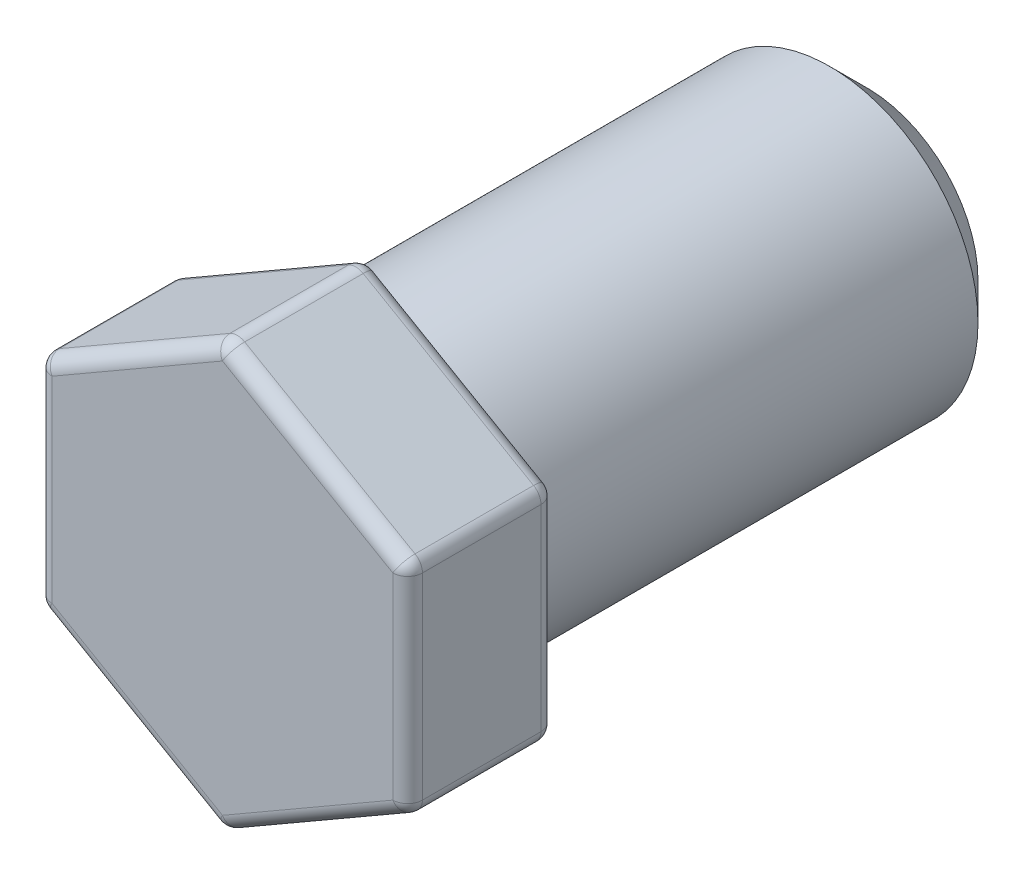
ISO-10303-21;
HEADER;
FILE_DESCRIPTION(('STEP AP214'),'2;1');
FILE_NAME('part.step','',(''),(''),'','','');
FILE_SCHEMA(('AUTOMOTIVE_DESIGN { 1 0 10303 214 1 1 1 1 }'));
ENDSEC;
DATA;
#1=APPLICATION_CONTEXT('core data for automotive mechanical design processes');
#2=APPLICATION_PROTOCOL_DEFINITION('international standard','automotive_design',2000,#1);
#3=PRODUCT_CONTEXT('',#1,'mechanical');
#4=PRODUCT('Part','Part','',(#3));
#5=PRODUCT_RELATED_PRODUCT_CATEGORY('part','',(#4));
#6=PRODUCT_DEFINITION_FORMATION('','',#4);
#7=PRODUCT_DEFINITION_CONTEXT('part definition',#1,'design');
#8=PRODUCT_DEFINITION('design','',#6,#7);
#9=PRODUCT_DEFINITION_SHAPE('','',#8);
#10=(LENGTH_UNIT() NAMED_UNIT(*) SI_UNIT(.MILLI.,.METRE.));
#11=(NAMED_UNIT(*) PLANE_ANGLE_UNIT() SI_UNIT($,.RADIAN.));
#12=(NAMED_UNIT(*) SI_UNIT($,.STERADIAN.) SOLID_ANGLE_UNIT());
#13=UNCERTAINTY_MEASURE_WITH_UNIT(LENGTH_MEASURE(1.E-05),#10,'distance_accuracy_value','');
#14=(GEOMETRIC_REPRESENTATION_CONTEXT(3) GLOBAL_UNCERTAINTY_ASSIGNED_CONTEXT((#13)) GLOBAL_UNIT_ASSIGNED_CONTEXT((#10,
#11,#12)) REPRESENTATION_CONTEXT('',''));
#15=CARTESIAN_POINT('',(0.,0.,0.));
#16=DIRECTION('',(0.,0.,1.));
#17=DIRECTION('',(1.,0.,0.));
#18=AXIS2_PLACEMENT_3D('',#15,#16,#17);
#19=CARTESIAN_POINT('',(0.,0.,6.7));
#20=DIRECTION('',(0.,0.,-1.));
#21=DIRECTION('',(-1.,0.,0.));
#22=AXIS2_PLACEMENT_3D('',#19,#20,#21);
#23=CYLINDRICAL_SURFACE('',#22,2.);
#24=CARTESIAN_POINT('',(0.,0.,0.500000000000001));
#25=DIRECTION('',(0.,0.,1.));
#26=DIRECTION('',(1.,0.,0.));
#27=AXIS2_PLACEMENT_3D('',#24,#25,#26);
#28=CIRCLE('',#27,2.);
#29=CARTESIAN_POINT('',(2.,0.,0.500000000000001));
#30=VERTEX_POINT('',#29);
#31=EDGE_CURVE('E43',#30,#30,#28,.T.);
#32=ORIENTED_EDGE('',*,*,#31,.T.);
#33=EDGE_LOOP('',(#32));
#34=FACE_BOUND('',#33,.T.);
#35=CARTESIAN_POINT('',(0.,0.,6.5));
#36=DIRECTION('',(0.,0.,1.));
#37=DIRECTION('',(1.,0.,0.));
#38=AXIS2_PLACEMENT_3D('',#35,#36,#37);
#39=CIRCLE('',#38,2.);
#40=CARTESIAN_POINT('',(2.,0.,6.5));
#41=VERTEX_POINT('',#40);
#42=EDGE_CURVE('E260',#41,#41,#39,.F.);
#43=ORIENTED_EDGE('',*,*,#42,.T.);
#44=EDGE_LOOP('',(#43));
#45=FACE_BOUND('',#44,.T.);
#46=ADVANCED_FACE('F35',(#34,#45),#23,.T.);
#47=CARTESIAN_POINT('',(0.,0.,0.));
#48=DIRECTION('',(0.,0.,1.));
#49=DIRECTION('',(1.,0.,0.));
#50=AXIS2_PLACEMENT_3D('',#47,#48,#49);
#51=PLANE('',#50);
#52=CARTESIAN_POINT('',(0.,0.,0.));
#53=DIRECTION('',(0.,0.,1.));
#54=DIRECTION('',(1.,0.,0.));
#55=AXIS2_PLACEMENT_3D('',#52,#53,#54);
#56=CIRCLE('',#55,1.5);
#57=CARTESIAN_POINT('',(1.5,0.,0.));
#58=VERTEX_POINT('',#57);
#59=EDGE_CURVE('E11',#58,#58,#56,.F.);
#60=ORIENTED_EDGE('',*,*,#59,.T.);
#61=EDGE_LOOP('',(#60));
#62=FACE_BOUND('',#61,.T.);
#63=ADVANCED_FACE('F374',(#62),#51,.F.);
#64=CARTESIAN_POINT('',(0.,-2.88675134594813,8.7));
#65=DIRECTION('',(-0.5,0.866025403784439,0.));
#66=DIRECTION('',(-0.866025403784439,-0.5,0.));
#67=AXIS2_PLACEMENT_3D('',#64,#65,#66);
#68=PLANE('',#67);
#69=DIRECTION('',(0.866025403784439,0.5,0.));
#70=VECTOR('',#69,1.);
#71=CARTESIAN_POINT('',(0.,-2.88675134594813,8.5));
#72=LINE('',#71,#70);
#73=CARTESIAN_POINT('',(2.4,-1.50111069989303,8.5));
#74=VERTEX_POINT('',#73);
#75=CARTESIAN_POINT('',(0.0999999999999994,-2.82901631902917,8.5));
#76=VERTEX_POINT('',#75);
#77=EDGE_CURVE('E237',#74,#76,#72,.F.);
#78=ORIENTED_EDGE('',*,*,#77,.T.);
#79=DIRECTION('',(0.,0.,-1.));
#80=VECTOR('',#79,1.);
#81=CARTESIAN_POINT('',(0.0999999999999995,-2.82901631902917,8.7));
#82=LINE('',#81,#80);
#83=CARTESIAN_POINT('',(0.0999999999999995,-2.82901631902917,6.9));
#84=VERTEX_POINT('',#83);
#85=EDGE_CURVE('E308',#76,#84,#82,.T.);
#86=ORIENTED_EDGE('',*,*,#85,.T.);
#87=DIRECTION('',(0.866025403784439,0.5,0.));
#88=VECTOR('',#87,1.);
#89=CARTESIAN_POINT('',(0.,-2.88675134594813,6.9));
#90=LINE('',#89,#88);
#91=CARTESIAN_POINT('',(2.4,-1.50111069989303,6.9));
#92=VERTEX_POINT('',#91);
#93=EDGE_CURVE('E234',#84,#92,#90,.T.);
#94=ORIENTED_EDGE('',*,*,#93,.T.);
#95=DIRECTION('',(0.,0.,-1.));
#96=VECTOR('',#95,1.);
#97=CARTESIAN_POINT('',(2.4,-1.50111069989303,8.7));
#98=LINE('',#97,#96);
#99=EDGE_CURVE('E306',#92,#74,#98,.F.);
#100=ORIENTED_EDGE('',*,*,#99,.T.);
#101=EDGE_LOOP('',(#78,#86,#94,#100));
#102=FACE_BOUND('',#101,.T.);
#103=ADVANCED_FACE('F380',(#102),#68,.F.);
#104=CARTESIAN_POINT('',(2.5,-1.44337567297407,8.7));
#105=DIRECTION('',(-1.,0.,0.));
#106=DIRECTION('',(0.,-1.,0.));
#107=AXIS2_PLACEMENT_3D('',#104,#105,#106);
#108=PLANE('',#107);
#109=DIRECTION('',(0.,1.,0.));
#110=VECTOR('',#109,1.);
#111=CARTESIAN_POINT('',(2.5,-1.44337567297407,6.9));
#112=LINE('',#111,#110);
#113=CARTESIAN_POINT('',(2.5,-1.32790561913614,6.9));
#114=VERTEX_POINT('',#113);
#115=CARTESIAN_POINT('',(2.5,1.32790561913614,6.9));
#116=VERTEX_POINT('',#115);
#117=EDGE_CURVE('E228',#114,#116,#112,.T.);
#118=ORIENTED_EDGE('',*,*,#117,.T.);
#119=DIRECTION('',(0.,0.,-1.));
#120=VECTOR('',#119,1.);
#121=CARTESIAN_POINT('',(2.5,1.32790561913614,8.7));
#122=LINE('',#121,#120);
#123=CARTESIAN_POINT('',(2.5,1.32790561913614,8.5));
#124=VERTEX_POINT('',#123);
#125=EDGE_CURVE('E327',#116,#124,#122,.F.);
#126=ORIENTED_EDGE('',*,*,#125,.T.);
#127=DIRECTION('',(0.,1.,0.));
#128=VECTOR('',#127,1.);
#129=CARTESIAN_POINT('',(2.5,-1.44337567297407,8.5));
#130=LINE('',#129,#128);
#131=CARTESIAN_POINT('',(2.5,-1.32790561913614,8.5));
#132=VERTEX_POINT('',#131);
#133=EDGE_CURVE('E231',#124,#132,#130,.F.);
#134=ORIENTED_EDGE('',*,*,#133,.T.);
#135=DIRECTION('',(0.,0.,-1.));
#136=VECTOR('',#135,1.);
#137=CARTESIAN_POINT('',(2.5,-1.32790561913614,8.7));
#138=LINE('',#137,#136);
#139=EDGE_CURVE('E325',#132,#114,#138,.T.);
#140=ORIENTED_EDGE('',*,*,#139,.T.);
#141=EDGE_LOOP('',(#118,#126,#134,#140));
#142=FACE_BOUND('',#141,.T.);
#143=ADVANCED_FACE('F559',(#142),#108,.F.);
#144=CARTESIAN_POINT('',(2.5,1.44337567297407,8.7));
#145=DIRECTION('',(-0.5,-0.866025403784439,0.));
#146=DIRECTION('',(0.866025403784439,-0.5,0.));
#147=AXIS2_PLACEMENT_3D('',#144,#145,#146);
#148=PLANE('',#147);
#149=DIRECTION('',(-0.866025403784439,0.5,0.));
#150=VECTOR('',#149,1.);
#151=CARTESIAN_POINT('',(2.5,1.44337567297407,8.5));
#152=LINE('',#151,#150);
#153=CARTESIAN_POINT('',(0.0999999999999994,2.82901631902917,8.5));
#154=VERTEX_POINT('',#153);
#155=CARTESIAN_POINT('',(2.4,1.50111069989303,8.5));
#156=VERTEX_POINT('',#155);
#157=EDGE_CURVE('E226',#154,#156,#152,.F.);
#158=ORIENTED_EDGE('',*,*,#157,.T.);
#159=DIRECTION('',(0.,0.,-1.));
#160=VECTOR('',#159,1.);
#161=CARTESIAN_POINT('',(2.4,1.50111069989303,8.7));
#162=LINE('',#161,#160);
#163=CARTESIAN_POINT('',(2.4,1.50111069989303,6.9));
#164=VERTEX_POINT('',#163);
#165=EDGE_CURVE('E57',#156,#164,#162,.T.);
#166=ORIENTED_EDGE('',*,*,#165,.T.);
#167=DIRECTION('',(-0.866025403784439,0.5,0.));
#168=VECTOR('',#167,1.);
#169=CARTESIAN_POINT('',(2.5,1.44337567297407,6.9));
#170=LINE('',#169,#168);
#171=CARTESIAN_POINT('',(0.0999999999999994,2.82901631902917,6.9));
#172=VERTEX_POINT('',#171);
#173=EDGE_CURVE('E224',#164,#172,#170,.T.);
#174=ORIENTED_EDGE('',*,*,#173,.T.);
#175=DIRECTION('',(0.,0.,-1.));
#176=VECTOR('',#175,1.);
#177=CARTESIAN_POINT('',(0.0999999999999994,2.82901631902917,8.7));
#178=LINE('',#177,#176);
#179=EDGE_CURVE('E322',#172,#154,#178,.F.);
#180=ORIENTED_EDGE('',*,*,#179,.T.);
#181=EDGE_LOOP('',(#158,#166,#174,#180));
#182=FACE_BOUND('',#181,.T.);
#183=ADVANCED_FACE('F504',(#182),#148,.F.);
#184=CARTESIAN_POINT('',(0.,2.88675134594813,8.7));
#185=DIRECTION('',(0.5,-0.866025403784439,0.));
#186=DIRECTION('',(0.866025403784439,0.5,0.));
#187=AXIS2_PLACEMENT_3D('',#184,#185,#186);
#188=PLANE('',#187);
#189=DIRECTION('',(-0.866025403784439,-0.5,0.));
#190=VECTOR('',#189,1.);
#191=CARTESIAN_POINT('',(0.,2.88675134594813,6.9));
#192=LINE('',#191,#190);
#193=CARTESIAN_POINT('',(-0.1,2.82901631902917,6.9));
#194=VERTEX_POINT('',#193);
#195=CARTESIAN_POINT('',(-2.4,1.50111069989303,6.9));
#196=VERTEX_POINT('',#195);
#197=EDGE_CURVE('E218',#194,#196,#192,.T.);
#198=ORIENTED_EDGE('',*,*,#197,.T.);
#199=DIRECTION('',(0.,0.,-1.));
#200=VECTOR('',#199,1.);
#201=CARTESIAN_POINT('',(-2.4,1.50111069989303,8.7));
#202=LINE('',#201,#200);
#203=CARTESIAN_POINT('',(-2.4,1.50111069989303,8.5));
#204=VERTEX_POINT('',#203);
#205=EDGE_CURVE('E320',#196,#204,#202,.F.);
#206=ORIENTED_EDGE('',*,*,#205,.T.);
#207=DIRECTION('',(-0.866025403784439,-0.5,0.));
#208=VECTOR('',#207,1.);
#209=CARTESIAN_POINT('',(0.,2.88675134594813,8.5));
#210=LINE('',#209,#208);
#211=CARTESIAN_POINT('',(-0.1,2.82901631902917,8.5));
#212=VERTEX_POINT('',#211);
#213=EDGE_CURVE('E221',#204,#212,#210,.F.);
#214=ORIENTED_EDGE('',*,*,#213,.T.);
#215=DIRECTION('',(0.,0.,-1.));
#216=VECTOR('',#215,1.);
#217=CARTESIAN_POINT('',(-0.1,2.82901631902917,8.7));
#218=LINE('',#217,#216);
#219=EDGE_CURVE('E318',#212,#194,#218,.T.);
#220=ORIENTED_EDGE('',*,*,#219,.T.);
#221=EDGE_LOOP('',(#198,#206,#214,#220));
#222=FACE_BOUND('',#221,.T.);
#223=ADVANCED_FACE('F513',(#222),#188,.F.);
#224=CARTESIAN_POINT('',(-2.5,1.44337567297407,8.7));
#225=DIRECTION('',(1.,0.,0.));
#226=DIRECTION('',(0.,1.,0.));
#227=AXIS2_PLACEMENT_3D('',#224,#225,#226);
#228=PLANE('',#227);
#229=DIRECTION('',(0.,-1.,0.));
#230=VECTOR('',#229,1.);
#231=CARTESIAN_POINT('',(-2.5,1.44337567297407,6.9));
#232=LINE('',#231,#230);
#233=CARTESIAN_POINT('',(-2.5,1.32790561913614,6.9));
#234=VERTEX_POINT('',#233);
#235=CARTESIAN_POINT('',(-2.5,-1.32790561913614,6.9));
#236=VERTEX_POINT('',#235);
#237=EDGE_CURVE('E212',#234,#236,#232,.T.);
#238=ORIENTED_EDGE('',*,*,#237,.T.);
#239=DIRECTION('',(0.,0.,-1.));
#240=VECTOR('',#239,1.);
#241=CARTESIAN_POINT('',(-2.5,-1.32790561913614,8.7));
#242=LINE('',#241,#240);
#243=CARTESIAN_POINT('',(-2.5,-1.32790561913614,8.5));
#244=VERTEX_POINT('',#243);
#245=EDGE_CURVE('E316',#236,#244,#242,.F.);
#246=ORIENTED_EDGE('',*,*,#245,.T.);
#247=DIRECTION('',(0.,-1.,0.));
#248=VECTOR('',#247,1.);
#249=CARTESIAN_POINT('',(-2.5,1.44337567297407,8.5));
#250=LINE('',#249,#248);
#251=CARTESIAN_POINT('',(-2.5,1.32790561913614,8.5));
#252=VERTEX_POINT('',#251);
#253=EDGE_CURVE('E215',#244,#252,#250,.F.);
#254=ORIENTED_EDGE('',*,*,#253,.T.);
#255=DIRECTION('',(0.,0.,-1.));
#256=VECTOR('',#255,1.);
#257=CARTESIAN_POINT('',(-2.5,1.32790561913614,8.7));
#258=LINE('',#257,#256);
#259=EDGE_CURVE('E314',#252,#234,#258,.T.);
#260=ORIENTED_EDGE('',*,*,#259,.T.);
#261=EDGE_LOOP('',(#238,#246,#254,#260));
#262=FACE_BOUND('',#261,.T.);
#263=ADVANCED_FACE('F577',(#262),#228,.F.);
#264=CARTESIAN_POINT('',(-2.5,-1.44337567297406,8.7));
#265=DIRECTION('',(0.5,0.866025403784439,0.));
#266=DIRECTION('',(-0.866025403784439,0.5,0.));
#267=AXIS2_PLACEMENT_3D('',#264,#265,#266);
#268=PLANE('',#267);
#269=DIRECTION('',(0.866025403784439,-0.5,0.));
#270=VECTOR('',#269,1.);
#271=CARTESIAN_POINT('',(-2.5,-1.44337567297406,6.9));
#272=LINE('',#271,#270);
#273=CARTESIAN_POINT('',(-2.4,-1.50111069989303,6.9));
#274=VERTEX_POINT('',#273);
#275=CARTESIAN_POINT('',(-0.1,-2.82901631902917,6.9));
#276=VERTEX_POINT('',#275);
#277=EDGE_CURVE('E203',#274,#276,#272,.T.);
#278=ORIENTED_EDGE('',*,*,#277,.T.);
#279=DIRECTION('',(0.,0.,-1.));
#280=VECTOR('',#279,1.);
#281=CARTESIAN_POINT('',(-0.1,-2.82901631902917,8.7));
#282=LINE('',#281,#280);
#283=CARTESIAN_POINT('',(-0.1,-2.82901631902917,8.5));
#284=VERTEX_POINT('',#283);
#285=EDGE_CURVE('E312',#276,#284,#282,.F.);
#286=ORIENTED_EDGE('',*,*,#285,.T.);
#287=DIRECTION('',(0.866025403784439,-0.5,0.));
#288=VECTOR('',#287,1.);
#289=CARTESIAN_POINT('',(-2.5,-1.44337567297406,8.5));
#290=LINE('',#289,#288);
#291=CARTESIAN_POINT('',(-2.4,-1.50111069989303,8.5));
#292=VERTEX_POINT('',#291);
#293=EDGE_CURVE('E184',#284,#292,#290,.F.);
#294=ORIENTED_EDGE('',*,*,#293,.T.);
#295=DIRECTION('',(0.,0.,-1.));
#296=VECTOR('',#295,1.);
#297=CARTESIAN_POINT('',(-2.4,-1.50111069989303,8.7));
#298=LINE('',#297,#296);
#299=EDGE_CURVE('E310',#292,#274,#298,.T.);
#300=ORIENTED_EDGE('',*,*,#299,.T.);
#301=EDGE_LOOP('',(#278,#286,#294,#300));
#302=FACE_BOUND('',#301,.T.);
#303=ADVANCED_FACE('F529',(#302),#268,.F.);
#304=CARTESIAN_POINT('',(0.,0.,8.7));
#305=DIRECTION('',(0.,0.,1.));
#306=DIRECTION('',(1.,0.,0.));
#307=AXIS2_PLACEMENT_3D('',#304,#305,#306);
#308=PLANE('',#307);
#309=DIRECTION('',(0.,-1.,0.));
#310=VECTOR('',#309,1.);
#311=CARTESIAN_POINT('',(-2.3,-1.44337567297406,8.7));
#312=LINE('',#311,#310);
#313=CARTESIAN_POINT('',(-2.3,1.32790561913614,8.7));
#314=VERTEX_POINT('',#313);
#315=CARTESIAN_POINT('',(-2.3,-1.32790561913614,8.7));
#316=VERTEX_POINT('',#315);
#317=EDGE_CURVE('E202',#314,#316,#312,.T.);
#318=ORIENTED_EDGE('',*,*,#317,.T.);
#319=DIRECTION('',(0.866025403784439,-0.5,0.));
#320=VECTOR('',#319,1.);
#321=CARTESIAN_POINT('',(0.0999999999999996,-2.71354626519124,8.7));
#322=LINE('',#321,#320);
#323=CARTESIAN_POINT('',(0.,-2.65581123827228,8.7));
#324=VERTEX_POINT('',#323);
#325=EDGE_CURVE('E181',#316,#324,#322,.T.);
#326=ORIENTED_EDGE('',*,*,#325,.T.);
#327=DIRECTION('',(0.866025403784439,0.5,0.));
#328=VECTOR('',#327,1.);
#329=CARTESIAN_POINT('',(2.4,-1.27017059221718,8.7));
#330=LINE('',#329,#328);
#331=CARTESIAN_POINT('',(2.3,-1.32790561913614,8.7));
#332=VERTEX_POINT('',#331);
#333=EDGE_CURVE('E189',#324,#332,#330,.T.);
#334=ORIENTED_EDGE('',*,*,#333,.T.);
#335=DIRECTION('',(0.,1.,0.));
#336=VECTOR('',#335,1.);
#337=CARTESIAN_POINT('',(2.3,1.44337567297407,8.7));
#338=LINE('',#337,#336);
#339=CARTESIAN_POINT('',(2.3,1.32790561913614,8.7));
#340=VERTEX_POINT('',#339);
#341=EDGE_CURVE('E195',#332,#340,#338,.T.);
#342=ORIENTED_EDGE('',*,*,#341,.T.);
#343=DIRECTION('',(-0.866025403784439,0.5,0.));
#344=VECTOR('',#343,1.);
#345=CARTESIAN_POINT('',(-0.1,2.71354626519124,8.7));
#346=LINE('',#345,#344);
#347=CARTESIAN_POINT('',(0.,2.65581123827228,8.7));
#348=VERTEX_POINT('',#347);
#349=EDGE_CURVE('E520',#340,#348,#346,.T.);
#350=ORIENTED_EDGE('',*,*,#349,.T.);
#351=DIRECTION('',(-0.866025403784439,-0.5,0.));
#352=VECTOR('',#351,1.);
#353=CARTESIAN_POINT('',(-2.4,1.27017059221718,8.7));
#354=LINE('',#353,#352);
#355=EDGE_CURVE('E207',#348,#314,#354,.T.);
#356=ORIENTED_EDGE('',*,*,#355,.T.);
#357=EDGE_LOOP('',(#318,#326,#334,#342,#350,#356));
#358=FACE_BOUND('',#357,.T.);
#359=ADVANCED_FACE('F199',(#358),#308,.T.);
#360=CARTESIAN_POINT('',(0.,0.,6.7));
#361=DIRECTION('',(0.,0.,1.));
#362=DIRECTION('',(1.,0.,0.));
#363=AXIS2_PLACEMENT_3D('',#360,#361,#362);
#364=PLANE('',#363);
#365=DIRECTION('',(-0.866025403784439,0.5,0.));
#366=VECTOR('',#365,1.);
#367=CARTESIAN_POINT('',(1.15,1.99185842870421,6.7));
#368=LINE('',#367,#366);
#369=CARTESIAN_POINT('',(0.,2.65581123827228,6.7));
#370=VERTEX_POINT('',#369);
#371=CARTESIAN_POINT('',(2.3,1.32790561913614,6.7));
#372=VERTEX_POINT('',#371);
#373=EDGE_CURVE('E254',#370,#372,#368,.F.);
#374=ORIENTED_EDGE('',*,*,#373,.T.);
#375=DIRECTION('',(0.,1.,0.));
#376=VECTOR('',#375,1.);
#377=CARTESIAN_POINT('',(2.3,0.,6.7));
#378=LINE('',#377,#376);
#379=CARTESIAN_POINT('',(2.3,-1.32790561913614,6.7));
#380=VERTEX_POINT('',#379);
#381=EDGE_CURVE('E257',#372,#380,#378,.F.);
#382=ORIENTED_EDGE('',*,*,#381,.T.);
#383=DIRECTION('',(0.866025403784439,0.5,0.));
#384=VECTOR('',#383,1.);
#385=CARTESIAN_POINT('',(1.15,-1.99185842870421,6.7));
#386=LINE('',#385,#384);
#387=CARTESIAN_POINT('',(0.,-2.65581123827228,6.7));
#388=VERTEX_POINT('',#387);
#389=EDGE_CURVE('E242',#380,#388,#386,.F.);
#390=ORIENTED_EDGE('',*,*,#389,.T.);
#391=DIRECTION('',(0.866025403784439,-0.5,0.));
#392=VECTOR('',#391,1.);
#393=CARTESIAN_POINT('',(-1.15,-1.99185842870421,6.7));
#394=LINE('',#393,#392);
#395=CARTESIAN_POINT('',(-2.3,-1.32790561913614,6.7));
#396=VERTEX_POINT('',#395);
#397=EDGE_CURVE('E245',#388,#396,#394,.F.);
#398=ORIENTED_EDGE('',*,*,#397,.T.);
#399=DIRECTION('',(0.,-1.,0.));
#400=VECTOR('',#399,1.);
#401=CARTESIAN_POINT('',(-2.3,0.,6.7));
#402=LINE('',#401,#400);
#403=CARTESIAN_POINT('',(-2.3,1.32790561913614,6.7));
#404=VERTEX_POINT('',#403);
#405=EDGE_CURVE('E248',#396,#404,#402,.F.);
#406=ORIENTED_EDGE('',*,*,#405,.T.);
#407=DIRECTION('',(-0.866025403784439,-0.5,0.));
#408=VECTOR('',#407,1.);
#409=CARTESIAN_POINT('',(-1.15,1.99185842870421,6.7));
#410=LINE('',#409,#408);
#411=EDGE_CURVE('E251',#404,#370,#410,.F.);
#412=ORIENTED_EDGE('',*,*,#411,.T.);
#413=EDGE_LOOP('',(#374,#382,#390,#398,#406,#412));
#414=FACE_BOUND('',#413,.T.);
#415=CARTESIAN_POINT('',(0.,0.,6.7));
#416=DIRECTION('',(0.,0.,1.));
#417=DIRECTION('',(1.,0.,0.));
#418=AXIS2_PLACEMENT_3D('',#415,#416,#417);
#419=CIRCLE('',#418,2.2);
#420=CARTESIAN_POINT('',(2.2,0.,6.7));
#421=VERTEX_POINT('',#420);
#422=EDGE_CURVE('E239',#421,#421,#419,.T.);
#423=ORIENTED_EDGE('',*,*,#422,.T.);
#424=EDGE_LOOP('',(#423));
#425=FACE_BOUND('',#424,.T.);
#426=ADVANCED_FACE('F405',(#414,#425),#364,.F.);
#427=CARTESIAN_POINT('',(1.15,1.99185842870421,8.5));
#428=DIRECTION('',(0.866025403784439,-0.5,0.));
#429=DIRECTION('',(0.5,0.866025403784439,0.));
#430=AXIS2_PLACEMENT_3D('',#427,#428,#429);
#431=CYLINDRICAL_SURFACE('',#430,0.2);
#432=ORIENTED_EDGE('',*,*,#349,.F.);
#433=CARTESIAN_POINT('',(2.3,1.32790561913614,8.5));
#434=DIRECTION('',(0.866025403784439,-0.5,0.));
#435=DIRECTION('',(0.5,0.866025403784439,0.));
#436=AXIS2_PLACEMENT_3D('',#433,#434,#435);
#437=CIRCLE('',#436,0.2);
#438=EDGE_CURVE('E297',#340,#156,#437,.F.);
#439=ORIENTED_EDGE('',*,*,#438,.T.);
#440=ORIENTED_EDGE('',*,*,#157,.F.);
#441=CARTESIAN_POINT('',(0.,2.65581123827228,8.5));
#442=DIRECTION('',(0.866025403784439,-0.5,0.));
#443=DIRECTION('',(0.5,0.866025403784439,0.));
#444=AXIS2_PLACEMENT_3D('',#441,#442,#443);
#445=CIRCLE('',#444,0.2);
#446=EDGE_CURVE('E295',#154,#348,#445,.T.);
#447=ORIENTED_EDGE('',*,*,#446,.T.);
#448=EDGE_LOOP('',(#432,#439,#440,#447));
#449=FACE_BOUND('',#448,.T.);
#450=ADVANCED_FACE('F401',(#449),#431,.T.);
#451=CARTESIAN_POINT('',(-1.15,1.99185842870421,8.5));
#452=DIRECTION('',(0.866025403784439,0.5,0.));
#453=DIRECTION('',(-0.5,0.866025403784439,0.));
#454=AXIS2_PLACEMENT_3D('',#451,#452,#453);
#455=CYLINDRICAL_SURFACE('',#454,0.2);
#456=ORIENTED_EDGE('',*,*,#213,.F.);
#457=CARTESIAN_POINT('',(-2.3,1.32790561913614,8.5));
#458=DIRECTION('',(0.866025403784439,0.5,0.));
#459=DIRECTION('',(-0.5,0.866025403784439,0.));
#460=AXIS2_PLACEMENT_3D('',#457,#458,#459);
#461=CIRCLE('',#460,0.2);
#462=EDGE_CURVE('E284',#204,#314,#461,.T.);
#463=ORIENTED_EDGE('',*,*,#462,.T.);
#464=ORIENTED_EDGE('',*,*,#355,.F.);
#465=CARTESIAN_POINT('',(0.,2.65581123827228,8.5));
#466=DIRECTION('',(0.866025403784439,0.5,0.));
#467=DIRECTION('',(-0.5,0.866025403784439,0.));
#468=AXIS2_PLACEMENT_3D('',#465,#466,#467);
#469=CIRCLE('',#468,0.2);
#470=EDGE_CURVE('E281',#348,#212,#469,.F.);
#471=ORIENTED_EDGE('',*,*,#470,.T.);
#472=EDGE_LOOP('',(#456,#463,#464,#471));
#473=FACE_BOUND('',#472,.T.);
#474=ADVANCED_FACE('F397',(#473),#455,.T.);
#475=CARTESIAN_POINT('',(2.3,0.,8.5));
#476=DIRECTION('',(0.,-1.,0.));
#477=DIRECTION('',(1.,0.,0.));
#478=AXIS2_PLACEMENT_3D('',#475,#476,#477);
#479=CYLINDRICAL_SURFACE('',#478,0.2);
#480=ORIENTED_EDGE('',*,*,#133,.F.);
#481=CARTESIAN_POINT('',(2.3,1.32790561913614,8.5));
#482=DIRECTION('',(0.,-1.,0.));
#483=DIRECTION('',(1.,0.,0.));
#484=AXIS2_PLACEMENT_3D('',#481,#482,#483);
#485=CIRCLE('',#484,0.2);
#486=EDGE_CURVE('E292',#124,#340,#485,.T.);
#487=ORIENTED_EDGE('',*,*,#486,.T.);
#488=ORIENTED_EDGE('',*,*,#341,.F.);
#489=CARTESIAN_POINT('',(2.3,-1.32790561913614,8.5));
#490=DIRECTION('',(0.,-1.,0.));
#491=DIRECTION('',(1.,0.,0.));
#492=AXIS2_PLACEMENT_3D('',#489,#490,#491);
#493=CIRCLE('',#492,0.2);
#494=EDGE_CURVE('E290',#332,#132,#493,.F.);
#495=ORIENTED_EDGE('',*,*,#494,.T.);
#496=EDGE_LOOP('',(#480,#487,#488,#495));
#497=FACE_BOUND('',#496,.T.);
#498=ADVANCED_FACE('F393',(#497),#479,.T.);
#499=CARTESIAN_POINT('',(-2.3,0.,8.5));
#500=DIRECTION('',(0.,1.,0.));
#501=DIRECTION('',(-1.,0.,0.));
#502=AXIS2_PLACEMENT_3D('',#499,#500,#501);
#503=CYLINDRICAL_SURFACE('',#502,0.2);
#504=ORIENTED_EDGE('',*,*,#253,.F.);
#505=CARTESIAN_POINT('',(-2.3,-1.32790561913614,8.5));
#506=DIRECTION('',(0.,1.,0.));
#507=DIRECTION('',(-1.,0.,0.));
#508=AXIS2_PLACEMENT_3D('',#505,#506,#507);
#509=CIRCLE('',#508,0.2);
#510=EDGE_CURVE('E275',#244,#316,#509,.T.);
#511=ORIENTED_EDGE('',*,*,#510,.T.);
#512=ORIENTED_EDGE('',*,*,#317,.F.);
#513=CARTESIAN_POINT('',(-2.3,1.32790561913614,8.5));
#514=DIRECTION('',(0.,1.,0.));
#515=DIRECTION('',(-1.,0.,0.));
#516=AXIS2_PLACEMENT_3D('',#513,#514,#515);
#517=CIRCLE('',#516,0.2);
#518=EDGE_CURVE('E272',#314,#252,#517,.F.);
#519=ORIENTED_EDGE('',*,*,#518,.T.);
#520=EDGE_LOOP('',(#504,#511,#512,#519));
#521=FACE_BOUND('',#520,.T.);
#522=ADVANCED_FACE('F390',(#521),#503,.T.);
#523=CARTESIAN_POINT('',(1.15,-1.99185842870421,8.5));
#524=DIRECTION('',(-0.866025403784439,-0.5,0.));
#525=DIRECTION('',(0.5,-0.866025403784439,0.));
#526=AXIS2_PLACEMENT_3D('',#523,#524,#525);
#527=CYLINDRICAL_SURFACE('',#526,0.2);
#528=ORIENTED_EDGE('',*,*,#333,.F.);
#529=CARTESIAN_POINT('',(0.,-2.65581123827228,8.5));
#530=DIRECTION('',(-0.866025403784439,-0.5,0.));
#531=DIRECTION('',(0.5,-0.866025403784439,0.));
#532=AXIS2_PLACEMENT_3D('',#529,#530,#531);
#533=CIRCLE('',#532,0.2);
#534=EDGE_CURVE('E162',#324,#76,#533,.F.);
#535=ORIENTED_EDGE('',*,*,#534,.T.);
#536=ORIENTED_EDGE('',*,*,#77,.F.);
#537=CARTESIAN_POINT('',(2.3,-1.32790561913614,8.5));
#538=DIRECTION('',(-0.866025403784439,-0.5,0.));
#539=DIRECTION('',(0.5,-0.866025403784439,0.));
#540=AXIS2_PLACEMENT_3D('',#537,#538,#539);
#541=CIRCLE('',#540,0.2);
#542=EDGE_CURVE('E173',#74,#332,#541,.T.);
#543=ORIENTED_EDGE('',*,*,#542,.T.);
#544=EDGE_LOOP('',(#528,#535,#536,#543));
#545=FACE_BOUND('',#544,.T.);
#546=ADVANCED_FACE('F190',(#545),#527,.T.);
#547=CARTESIAN_POINT('',(-1.15,-1.99185842870421,8.5));
#548=DIRECTION('',(-0.866025403784439,0.5,0.));
#549=DIRECTION('',(-0.5,-0.866025403784439,0.));
#550=AXIS2_PLACEMENT_3D('',#547,#548,#549);
#551=CYLINDRICAL_SURFACE('',#550,0.2);
#552=ORIENTED_EDGE('',*,*,#293,.F.);
#553=CARTESIAN_POINT('',(0.,-2.65581123827228,8.5));
#554=DIRECTION('',(-0.866025403784439,0.5,0.));
#555=DIRECTION('',(-0.5,-0.866025403784439,0.));
#556=AXIS2_PLACEMENT_3D('',#553,#554,#555);
#557=CIRCLE('',#556,0.2);
#558=EDGE_CURVE('E165',#284,#324,#557,.T.);
#559=ORIENTED_EDGE('',*,*,#558,.T.);
#560=ORIENTED_EDGE('',*,*,#325,.F.);
#561=CARTESIAN_POINT('',(-2.3,-1.32790561913614,8.5));
#562=DIRECTION('',(-0.866025403784439,0.5,0.));
#563=DIRECTION('',(-0.5,-0.866025403784439,0.));
#564=AXIS2_PLACEMENT_3D('',#561,#562,#563);
#565=CIRCLE('',#564,0.2);
#566=EDGE_CURVE('E185',#316,#292,#565,.F.);
#567=ORIENTED_EDGE('',*,*,#566,.T.);
#568=EDGE_LOOP('',(#552,#559,#560,#567));
#569=FACE_BOUND('',#568,.T.);
#570=ADVANCED_FACE('F178',(#569),#551,.T.);
#571=CARTESIAN_POINT('',(-2.3,1.44337567297407,6.9));
#572=DIRECTION('',(0.,-1.,0.));
#573=DIRECTION('',(1.,0.,0.));
#574=AXIS2_PLACEMENT_3D('',#571,#572,#573);
#575=CYLINDRICAL_SURFACE('',#574,0.2);
#576=ORIENTED_EDGE('',*,*,#405,.F.);
#577=CARTESIAN_POINT('',(-2.3,-1.32790561913614,6.9));
#578=DIRECTION('',(0.,-1.,0.));
#579=DIRECTION('',(1.,0.,0.));
#580=AXIS2_PLACEMENT_3D('',#577,#578,#579);
#581=CIRCLE('',#580,0.2);
#582=EDGE_CURVE('E279',#396,#236,#581,.F.);
#583=ORIENTED_EDGE('',*,*,#582,.T.);
#584=ORIENTED_EDGE('',*,*,#237,.F.);
#585=CARTESIAN_POINT('',(-2.3,1.32790561913614,6.9));
#586=DIRECTION('',(0.,-1.,0.));
#587=DIRECTION('',(1.,0.,0.));
#588=AXIS2_PLACEMENT_3D('',#585,#586,#587);
#589=CIRCLE('',#588,0.2);
#590=EDGE_CURVE('E277',#234,#404,#589,.T.);
#591=ORIENTED_EDGE('',*,*,#590,.T.);
#592=EDGE_LOOP('',(#576,#583,#584,#591));
#593=FACE_BOUND('',#592,.T.);
#594=ADVANCED_FACE('F387',(#593),#575,.T.);
#595=CARTESIAN_POINT('',(-2.4,-1.27017059221718,6.9));
#596=DIRECTION('',(0.866025403784439,-0.5,0.));
#597=DIRECTION('',(0.5,0.866025403784439,0.));
#598=AXIS2_PLACEMENT_3D('',#595,#596,#597);
#599=CYLINDRICAL_SURFACE('',#598,0.2);
#600=ORIENTED_EDGE('',*,*,#397,.F.);
#601=CARTESIAN_POINT('',(0.,-2.65581123827228,6.9));
#602=DIRECTION('',(0.866025403784439,-0.5,0.));
#603=DIRECTION('',(0.5,0.866025403784439,0.));
#604=AXIS2_PLACEMENT_3D('',#601,#602,#603);
#605=CIRCLE('',#604,0.2);
#606=EDGE_CURVE('E270',#388,#276,#605,.F.);
#607=ORIENTED_EDGE('',*,*,#606,.T.);
#608=ORIENTED_EDGE('',*,*,#277,.F.);
#609=CARTESIAN_POINT('',(-2.3,-1.32790561913614,6.9));
#610=DIRECTION('',(0.866025403784439,-0.5,0.));
#611=DIRECTION('',(0.5,0.866025403784439,0.));
#612=AXIS2_PLACEMENT_3D('',#609,#610,#611);
#613=CIRCLE('',#612,0.2);
#614=EDGE_CURVE('E268',#274,#396,#613,.T.);
#615=ORIENTED_EDGE('',*,*,#614,.T.);
#616=EDGE_LOOP('',(#600,#607,#608,#615));
#617=FACE_BOUND('',#616,.T.);
#618=ADVANCED_FACE('F422',(#617),#599,.T.);
#619=CARTESIAN_POINT('',(0.0999999999999996,2.71354626519124,6.9));
#620=DIRECTION('',(-0.866025403784439,-0.5,0.));
#621=DIRECTION('',(0.5,-0.866025403784439,0.));
#622=AXIS2_PLACEMENT_3D('',#619,#620,#621);
#623=CYLINDRICAL_SURFACE('',#622,0.2);
#624=ORIENTED_EDGE('',*,*,#411,.F.);
#625=CARTESIAN_POINT('',(-2.3,1.32790561913614,6.9));
#626=DIRECTION('',(-0.866025403784439,-0.5,0.));
#627=DIRECTION('',(0.5,-0.866025403784439,0.));
#628=AXIS2_PLACEMENT_3D('',#625,#626,#627);
#629=CIRCLE('',#628,0.2);
#630=EDGE_CURVE('E288',#404,#196,#629,.F.);
#631=ORIENTED_EDGE('',*,*,#630,.T.);
#632=ORIENTED_EDGE('',*,*,#197,.F.);
#633=CARTESIAN_POINT('',(0.,2.65581123827228,6.9));
#634=DIRECTION('',(-0.866025403784439,-0.5,0.));
#635=DIRECTION('',(0.5,-0.866025403784439,0.));
#636=AXIS2_PLACEMENT_3D('',#633,#634,#635);
#637=CIRCLE('',#636,0.2);
#638=EDGE_CURVE('E286',#194,#370,#637,.T.);
#639=ORIENTED_EDGE('',*,*,#638,.T.);
#640=EDGE_LOOP('',(#624,#631,#632,#639));
#641=FACE_BOUND('',#640,.T.);
#642=ADVANCED_FACE('F418',(#641),#623,.T.);
#643=CARTESIAN_POINT('',(-0.1,-2.71354626519124,6.9));
#644=DIRECTION('',(0.866025403784439,0.5,0.));
#645=DIRECTION('',(-0.5,0.866025403784439,0.));
#646=AXIS2_PLACEMENT_3D('',#643,#644,#645);
#647=CYLINDRICAL_SURFACE('',#646,0.2);
#648=ORIENTED_EDGE('',*,*,#93,.F.);
#649=CARTESIAN_POINT('',(0.,-2.65581123827228,6.9));
#650=DIRECTION('',(0.866025403784439,0.5,0.));
#651=DIRECTION('',(-0.5,0.866025403784439,0.));
#652=AXIS2_PLACEMENT_3D('',#649,#650,#651);
#653=CIRCLE('',#652,0.2);
#654=EDGE_CURVE('E266',#84,#388,#653,.T.);
#655=ORIENTED_EDGE('',*,*,#654,.T.);
#656=ORIENTED_EDGE('',*,*,#389,.F.);
#657=CARTESIAN_POINT('',(2.3,-1.32790561913614,6.9));
#658=DIRECTION('',(0.866025403784439,0.5,0.));
#659=DIRECTION('',(-0.5,0.866025403784439,0.));
#660=AXIS2_PLACEMENT_3D('',#657,#658,#659);
#661=CIRCLE('',#660,0.2);
#662=EDGE_CURVE('E172',#380,#92,#661,.F.);
#663=ORIENTED_EDGE('',*,*,#662,.T.);
#664=EDGE_LOOP('',(#648,#655,#656,#663));
#665=FACE_BOUND('',#664,.T.);
#666=ADVANCED_FACE('F415',(#665),#647,.T.);
#667=CARTESIAN_POINT('',(2.4,1.27017059221718,6.9));
#668=DIRECTION('',(-0.866025403784439,0.5,0.));
#669=DIRECTION('',(-0.5,-0.866025403784439,0.));
#670=AXIS2_PLACEMENT_3D('',#667,#668,#669);
#671=CYLINDRICAL_SURFACE('',#670,0.2);
#672=ORIENTED_EDGE('',*,*,#173,.F.);
#673=CARTESIAN_POINT('',(2.3,1.32790561913614,6.9));
#674=DIRECTION('',(-0.866025403784439,0.5,0.));
#675=DIRECTION('',(-0.5,-0.866025403784439,0.));
#676=AXIS2_PLACEMENT_3D('',#673,#674,#675);
#677=CIRCLE('',#676,0.2);
#678=EDGE_CURVE('E304',#164,#372,#677,.T.);
#679=ORIENTED_EDGE('',*,*,#678,.T.);
#680=ORIENTED_EDGE('',*,*,#373,.F.);
#681=CARTESIAN_POINT('',(0.,2.65581123827228,6.9));
#682=DIRECTION('',(-0.866025403784439,0.5,0.));
#683=DIRECTION('',(-0.5,-0.866025403784439,0.));
#684=AXIS2_PLACEMENT_3D('',#681,#682,#683);
#685=CIRCLE('',#684,0.2);
#686=EDGE_CURVE('E50',#370,#172,#685,.F.);
#687=ORIENTED_EDGE('',*,*,#686,.T.);
#688=EDGE_LOOP('',(#672,#679,#680,#687));
#689=FACE_BOUND('',#688,.T.);
#690=ADVANCED_FACE('F411',(#689),#671,.T.);
#691=CARTESIAN_POINT('',(2.3,-1.44337567297407,6.9));
#692=DIRECTION('',(0.,1.,0.));
#693=DIRECTION('',(-1.,0.,0.));
#694=AXIS2_PLACEMENT_3D('',#691,#692,#693);
#695=CYLINDRICAL_SURFACE('',#694,0.2);
#696=ORIENTED_EDGE('',*,*,#381,.F.);
#697=CARTESIAN_POINT('',(2.3,1.32790561913614,6.9));
#698=DIRECTION('',(0.,1.,0.));
#699=DIRECTION('',(-1.,0.,0.));
#700=AXIS2_PLACEMENT_3D('',#697,#698,#699);
#701=CIRCLE('',#700,0.2);
#702=EDGE_CURVE('E301',#372,#116,#701,.F.);
#703=ORIENTED_EDGE('',*,*,#702,.T.);
#704=ORIENTED_EDGE('',*,*,#117,.F.);
#705=CARTESIAN_POINT('',(2.3,-1.32790561913614,6.9));
#706=DIRECTION('',(0.,1.,0.));
#707=DIRECTION('',(-1.,0.,0.));
#708=AXIS2_PLACEMENT_3D('',#705,#706,#707);
#709=CIRCLE('',#708,0.2);
#710=EDGE_CURVE('E299',#114,#380,#709,.T.);
#711=ORIENTED_EDGE('',*,*,#710,.T.);
#712=EDGE_LOOP('',(#696,#703,#704,#711));
#713=FACE_BOUND('',#712,.T.);
#714=ADVANCED_FACE('F407',(#713),#695,.T.);
#715=CARTESIAN_POINT('',(0.,0.,6.5));
#716=DIRECTION('',(0.,0.,1.));
#717=DIRECTION('',(1.,0.,0.));
#718=AXIS2_PLACEMENT_3D('',#715,#716,#717);
#719=TOROIDAL_SURFACE('',#718,2.2,0.2);
#720=ORIENTED_EDGE('',*,*,#42,.F.);
#721=EDGE_LOOP('',(#720));
#722=FACE_BOUND('',#721,.T.);
#723=ORIENTED_EDGE('',*,*,#422,.F.);
#724=EDGE_LOOP('',(#723));
#725=FACE_BOUND('',#724,.T.);
#726=ADVANCED_FACE('F410',(#722,#725),#719,.F.);
#727=CARTESIAN_POINT('',(0.,-2.65581123827228,6.9));
#728=DIRECTION('',(0.,0.,1.));
#729=DIRECTION('',(1.,0.,0.));
#730=AXIS2_PLACEMENT_3D('',#727,#728,#729);
#731=SPHERICAL_SURFACE('',#730,0.2);
#732=ORIENTED_EDGE('',*,*,#606,.F.);
#733=ORIENTED_EDGE('',*,*,#654,.F.);
#734=CARTESIAN_POINT('',(0.,-2.65581123827228,6.9));
#735=DIRECTION('',(0.,0.,1.));
#736=DIRECTION('',(1.,0.,0.));
#737=AXIS2_PLACEMENT_3D('',#734,#735,#736);
#738=CIRCLE('',#737,0.2);
#739=EDGE_CURVE('E196',#276,#84,#738,.T.);
#740=ORIENTED_EDGE('',*,*,#739,.F.);
#741=EDGE_LOOP('',(#732,#733,#740));
#742=FACE_BOUND('',#741,.T.);
#743=ADVANCED_FACE('F432',(#742),#731,.T.);
#744=CARTESIAN_POINT('',(0.,-2.65581123827228,8.7));
#745=DIRECTION('',(0.,0.,-1.));
#746=DIRECTION('',(-1.,0.,0.));
#747=AXIS2_PLACEMENT_3D('',#744,#745,#746);
#748=CYLINDRICAL_SURFACE('',#747,0.2);
#749=ORIENTED_EDGE('',*,*,#739,.T.);
#750=ORIENTED_EDGE('',*,*,#85,.F.);
#751=CARTESIAN_POINT('',(0.,-2.65581123827228,8.5));
#752=DIRECTION('',(0.,0.,1.));
#753=DIRECTION('',(1.,0.,0.));
#754=AXIS2_PLACEMENT_3D('',#751,#752,#753);
#755=CIRCLE('',#754,0.2);
#756=EDGE_CURVE('E167',#284,#76,#755,.T.);
#757=ORIENTED_EDGE('',*,*,#756,.F.);
#758=ORIENTED_EDGE('',*,*,#285,.F.);
#759=EDGE_LOOP('',(#749,#750,#757,#758));
#760=FACE_BOUND('',#759,.T.);
#761=ADVANCED_FACE('F437',(#760),#748,.T.);
#762=CARTESIAN_POINT('',(0.,-2.65581123827228,8.5));
#763=DIRECTION('',(0.,0.,1.));
#764=DIRECTION('',(1.,0.,0.));
#765=AXIS2_PLACEMENT_3D('',#762,#763,#764);
#766=SPHERICAL_SURFACE('',#765,0.2);
#767=ORIENTED_EDGE('',*,*,#756,.T.);
#768=ORIENTED_EDGE('',*,*,#534,.F.);
#769=ORIENTED_EDGE('',*,*,#558,.F.);
#770=EDGE_LOOP('',(#767,#768,#769));
#771=FACE_BOUND('',#770,.T.);
#772=ADVANCED_FACE('F164',(#771),#766,.T.);
#773=CARTESIAN_POINT('',(-2.3,-1.32790561913614,6.9));
#774=DIRECTION('',(0.,0.,1.));
#775=DIRECTION('',(1.,0.,0.));
#776=AXIS2_PLACEMENT_3D('',#773,#774,#775);
#777=SPHERICAL_SURFACE('',#776,0.2);
#778=ORIENTED_EDGE('',*,*,#582,.F.);
#779=ORIENTED_EDGE('',*,*,#614,.F.);
#780=CARTESIAN_POINT('',(-2.3,-1.32790561913614,6.9));
#781=DIRECTION('',(0.,0.,1.));
#782=DIRECTION('',(1.,0.,0.));
#783=AXIS2_PLACEMENT_3D('',#780,#781,#782);
#784=CIRCLE('',#783,0.2);
#785=EDGE_CURVE('E330',#236,#274,#784,.T.);
#786=ORIENTED_EDGE('',*,*,#785,.F.);
#787=EDGE_LOOP('',(#778,#779,#786));
#788=FACE_BOUND('',#787,.T.);
#789=ADVANCED_FACE('F436',(#788),#777,.T.);
#790=CARTESIAN_POINT('',(-2.3,-1.32790561913614,8.7));
#791=DIRECTION('',(0.,0.,-1.));
#792=DIRECTION('',(-1.,0.,0.));
#793=AXIS2_PLACEMENT_3D('',#790,#791,#792);
#794=CYLINDRICAL_SURFACE('',#793,0.2);
#795=ORIENTED_EDGE('',*,*,#785,.T.);
#796=ORIENTED_EDGE('',*,*,#299,.F.);
#797=CARTESIAN_POINT('',(-2.3,-1.32790561913614,8.5));
#798=DIRECTION('',(0.,0.,1.));
#799=DIRECTION('',(1.,0.,0.));
#800=AXIS2_PLACEMENT_3D('',#797,#798,#799);
#801=CIRCLE('',#800,0.2);
#802=EDGE_CURVE('E333',#244,#292,#801,.T.);
#803=ORIENTED_EDGE('',*,*,#802,.F.);
#804=ORIENTED_EDGE('',*,*,#245,.F.);
#805=EDGE_LOOP('',(#795,#796,#803,#804));
#806=FACE_BOUND('',#805,.T.);
#807=ADVANCED_FACE('F448',(#806),#794,.T.);
#808=CARTESIAN_POINT('',(-2.3,-1.32790561913614,8.5));
#809=DIRECTION('',(0.,0.,1.));
#810=DIRECTION('',(1.,0.,0.));
#811=AXIS2_PLACEMENT_3D('',#808,#809,#810);
#812=SPHERICAL_SURFACE('',#811,0.2);
#813=ORIENTED_EDGE('',*,*,#566,.F.);
#814=ORIENTED_EDGE('',*,*,#510,.F.);
#815=ORIENTED_EDGE('',*,*,#802,.T.);
#816=EDGE_LOOP('',(#813,#814,#815));
#817=FACE_BOUND('',#816,.T.);
#818=ADVANCED_FACE('F444',(#817),#812,.T.);
#819=CARTESIAN_POINT('',(-2.3,1.32790561913614,6.9));
#820=DIRECTION('',(0.,0.,1.));
#821=DIRECTION('',(1.,0.,0.));
#822=AXIS2_PLACEMENT_3D('',#819,#820,#821);
#823=SPHERICAL_SURFACE('',#822,0.2);
#824=ORIENTED_EDGE('',*,*,#630,.F.);
#825=ORIENTED_EDGE('',*,*,#590,.F.);
#826=CARTESIAN_POINT('',(-2.3,1.32790561913614,6.9));
#827=DIRECTION('',(0.,0.,1.));
#828=DIRECTION('',(1.,0.,0.));
#829=AXIS2_PLACEMENT_3D('',#826,#827,#828);
#830=CIRCLE('',#829,0.2);
#831=EDGE_CURVE('E335',#196,#234,#830,.T.);
#832=ORIENTED_EDGE('',*,*,#831,.F.);
#833=EDGE_LOOP('',(#824,#825,#832));
#834=FACE_BOUND('',#833,.T.);
#835=ADVANCED_FACE('F447',(#834),#823,.T.);
#836=CARTESIAN_POINT('',(-2.3,1.32790561913614,8.7));
#837=DIRECTION('',(0.,0.,-1.));
#838=DIRECTION('',(-1.,0.,0.));
#839=AXIS2_PLACEMENT_3D('',#836,#837,#838);
#840=CYLINDRICAL_SURFACE('',#839,0.2);
#841=ORIENTED_EDGE('',*,*,#831,.T.);
#842=ORIENTED_EDGE('',*,*,#259,.F.);
#843=CARTESIAN_POINT('',(-2.3,1.32790561913614,8.5));
#844=DIRECTION('',(0.,0.,1.));
#845=DIRECTION('',(1.,0.,0.));
#846=AXIS2_PLACEMENT_3D('',#843,#844,#845);
#847=CIRCLE('',#846,0.2);
#848=EDGE_CURVE('E338',#204,#252,#847,.T.);
#849=ORIENTED_EDGE('',*,*,#848,.F.);
#850=ORIENTED_EDGE('',*,*,#205,.F.);
#851=EDGE_LOOP('',(#841,#842,#849,#850));
#852=FACE_BOUND('',#851,.T.);
#853=ADVANCED_FACE('F460',(#852),#840,.T.);
#854=CARTESIAN_POINT('',(-2.3,1.32790561913614,8.5));
#855=DIRECTION('',(0.,0.,1.));
#856=DIRECTION('',(1.,0.,0.));
#857=AXIS2_PLACEMENT_3D('',#854,#855,#856);
#858=SPHERICAL_SURFACE('',#857,0.2);
#859=ORIENTED_EDGE('',*,*,#518,.F.);
#860=ORIENTED_EDGE('',*,*,#462,.F.);
#861=ORIENTED_EDGE('',*,*,#848,.T.);
#862=EDGE_LOOP('',(#859,#860,#861));
#863=FACE_BOUND('',#862,.T.);
#864=ADVANCED_FACE('F456',(#863),#858,.T.);
#865=CARTESIAN_POINT('',(2.3,1.32790561913614,6.9));
#866=DIRECTION('',(0.,0.,1.));
#867=DIRECTION('',(1.,0.,0.));
#868=AXIS2_PLACEMENT_3D('',#865,#866,#867);
#869=SPHERICAL_SURFACE('',#868,0.2);
#870=ORIENTED_EDGE('',*,*,#702,.F.);
#871=ORIENTED_EDGE('',*,*,#678,.F.);
#872=CARTESIAN_POINT('',(2.3,1.32790561913614,6.9));
#873=DIRECTION('',(0.,0.,1.));
#874=DIRECTION('',(1.,0.,0.));
#875=AXIS2_PLACEMENT_3D('',#872,#873,#874);
#876=CIRCLE('',#875,0.2);
#877=EDGE_CURVE('E340',#116,#164,#876,.T.);
#878=ORIENTED_EDGE('',*,*,#877,.F.);
#879=EDGE_LOOP('',(#870,#871,#878));
#880=FACE_BOUND('',#879,.T.);
#881=ADVANCED_FACE('F459',(#880),#869,.T.);
#882=CARTESIAN_POINT('',(2.3,1.32790561913614,8.7));
#883=DIRECTION('',(0.,0.,-1.));
#884=DIRECTION('',(-1.,0.,0.));
#885=AXIS2_PLACEMENT_3D('',#882,#883,#884);
#886=CYLINDRICAL_SURFACE('',#885,0.2);
#887=ORIENTED_EDGE('',*,*,#877,.T.);
#888=ORIENTED_EDGE('',*,*,#165,.F.);
#889=CARTESIAN_POINT('',(2.3,1.32790561913614,8.5));
#890=DIRECTION('',(0.,0.,1.));
#891=DIRECTION('',(1.,0.,0.));
#892=AXIS2_PLACEMENT_3D('',#889,#890,#891);
#893=CIRCLE('',#892,0.2);
#894=EDGE_CURVE('E343',#124,#156,#893,.T.);
#895=ORIENTED_EDGE('',*,*,#894,.F.);
#896=ORIENTED_EDGE('',*,*,#125,.F.);
#897=EDGE_LOOP('',(#887,#888,#895,#896));
#898=FACE_BOUND('',#897,.T.);
#899=ADVANCED_FACE('F472',(#898),#886,.T.);
#900=CARTESIAN_POINT('',(2.3,1.32790561913614,8.5));
#901=DIRECTION('',(0.,0.,1.));
#902=DIRECTION('',(1.,0.,0.));
#903=AXIS2_PLACEMENT_3D('',#900,#901,#902);
#904=SPHERICAL_SURFACE('',#903,0.2);
#905=ORIENTED_EDGE('',*,*,#894,.T.);
#906=ORIENTED_EDGE('',*,*,#438,.F.);
#907=ORIENTED_EDGE('',*,*,#486,.F.);
#908=EDGE_LOOP('',(#905,#906,#907));
#909=FACE_BOUND('',#908,.T.);
#910=ADVANCED_FACE('F468',(#909),#904,.T.);
#911=CARTESIAN_POINT('',(2.3,-1.32790561913614,6.9));
#912=DIRECTION('',(0.,0.,1.));
#913=DIRECTION('',(1.,0.,0.));
#914=AXIS2_PLACEMENT_3D('',#911,#912,#913);
#915=SPHERICAL_SURFACE('',#914,0.2);
#916=ORIENTED_EDGE('',*,*,#662,.F.);
#917=ORIENTED_EDGE('',*,*,#710,.F.);
#918=CARTESIAN_POINT('',(2.3,-1.32790561913614,6.9));
#919=DIRECTION('',(0.,0.,1.));
#920=DIRECTION('',(1.,0.,0.));
#921=AXIS2_PLACEMENT_3D('',#918,#919,#920);
#922=CIRCLE('',#921,0.2);
#923=EDGE_CURVE('E346',#92,#114,#922,.T.);
#924=ORIENTED_EDGE('',*,*,#923,.F.);
#925=EDGE_LOOP('',(#916,#917,#924));
#926=FACE_BOUND('',#925,.T.);
#927=ADVANCED_FACE('F471',(#926),#915,.T.);
#928=CARTESIAN_POINT('',(2.3,-1.32790561913614,8.7));
#929=DIRECTION('',(0.,0.,-1.));
#930=DIRECTION('',(-1.,0.,0.));
#931=AXIS2_PLACEMENT_3D('',#928,#929,#930);
#932=CYLINDRICAL_SURFACE('',#931,0.2);
#933=ORIENTED_EDGE('',*,*,#923,.T.);
#934=ORIENTED_EDGE('',*,*,#139,.F.);
#935=CARTESIAN_POINT('',(2.3,-1.32790561913614,8.5));
#936=DIRECTION('',(0.,0.,1.));
#937=DIRECTION('',(1.,0.,0.));
#938=AXIS2_PLACEMENT_3D('',#935,#936,#937);
#939=CIRCLE('',#938,0.2);
#940=EDGE_CURVE('E349',#74,#132,#939,.T.);
#941=ORIENTED_EDGE('',*,*,#940,.F.);
#942=ORIENTED_EDGE('',*,*,#99,.F.);
#943=EDGE_LOOP('',(#933,#934,#941,#942));
#944=FACE_BOUND('',#943,.T.);
#945=ADVANCED_FACE('F484',(#944),#932,.T.);
#946=CARTESIAN_POINT('',(2.3,-1.32790561913614,8.5));
#947=DIRECTION('',(0.,0.,1.));
#948=DIRECTION('',(1.,0.,0.));
#949=AXIS2_PLACEMENT_3D('',#946,#947,#948);
#950=SPHERICAL_SURFACE('',#949,0.2);
#951=ORIENTED_EDGE('',*,*,#940,.T.);
#952=ORIENTED_EDGE('',*,*,#494,.F.);
#953=ORIENTED_EDGE('',*,*,#542,.F.);
#954=EDGE_LOOP('',(#951,#952,#953));
#955=FACE_BOUND('',#954,.T.);
#956=ADVANCED_FACE('F480',(#955),#950,.T.);
#957=CARTESIAN_POINT('',(0.,2.65581123827228,6.9));
#958=DIRECTION('',(0.,0.,1.));
#959=DIRECTION('',(1.,0.,0.));
#960=AXIS2_PLACEMENT_3D('',#957,#958,#959);
#961=SPHERICAL_SURFACE('',#960,0.2);
#962=ORIENTED_EDGE('',*,*,#686,.F.);
#963=ORIENTED_EDGE('',*,*,#638,.F.);
#964=CARTESIAN_POINT('',(0.,2.65581123827228,6.9));
#965=DIRECTION('',(0.,0.,1.));
#966=DIRECTION('',(1.,0.,0.));
#967=AXIS2_PLACEMENT_3D('',#964,#965,#966);
#968=CIRCLE('',#967,0.2);
#969=EDGE_CURVE('E352',#172,#194,#968,.T.);
#970=ORIENTED_EDGE('',*,*,#969,.F.);
#971=EDGE_LOOP('',(#962,#963,#970));
#972=FACE_BOUND('',#971,.T.);
#973=ADVANCED_FACE('F483',(#972),#961,.T.);
#974=CARTESIAN_POINT('',(0.,2.65581123827228,8.7));
#975=DIRECTION('',(0.,0.,-1.));
#976=DIRECTION('',(-1.,0.,0.));
#977=AXIS2_PLACEMENT_3D('',#974,#975,#976);
#978=CYLINDRICAL_SURFACE('',#977,0.2);
#979=ORIENTED_EDGE('',*,*,#969,.T.);
#980=ORIENTED_EDGE('',*,*,#219,.F.);
#981=CARTESIAN_POINT('',(0.,2.65581123827228,8.5));
#982=DIRECTION('',(0.,0.,1.));
#983=DIRECTION('',(1.,0.,0.));
#984=AXIS2_PLACEMENT_3D('',#981,#982,#983);
#985=CIRCLE('',#984,0.2);
#986=EDGE_CURVE('E355',#154,#212,#985,.T.);
#987=ORIENTED_EDGE('',*,*,#986,.F.);
#988=ORIENTED_EDGE('',*,*,#179,.F.);
#989=EDGE_LOOP('',(#979,#980,#987,#988));
#990=FACE_BOUND('',#989,.T.);
#991=ADVANCED_FACE('F369',(#990),#978,.T.);
#992=CARTESIAN_POINT('',(0.,2.65581123827228,8.5));
#993=DIRECTION('',(0.,0.,1.));
#994=DIRECTION('',(1.,0.,0.));
#995=AXIS2_PLACEMENT_3D('',#992,#993,#994);
#996=SPHERICAL_SURFACE('',#995,0.2);
#997=ORIENTED_EDGE('',*,*,#470,.F.);
#998=ORIENTED_EDGE('',*,*,#446,.F.);
#999=ORIENTED_EDGE('',*,*,#986,.T.);
#1000=EDGE_LOOP('',(#997,#998,#999));
#1001=FACE_BOUND('',#1000,.T.);
#1002=ADVANCED_FACE('F364',(#1001),#996,.T.);
#1003=CARTESIAN_POINT('',(0.,0.,0.500000000000001));
#1004=DIRECTION('',(0.,0.,1.));
#1005=DIRECTION('',(1.,0.,0.));
#1006=AXIS2_PLACEMENT_3D('',#1003,#1004,#1005);
#1007=CONICAL_SURFACE('',#1006,2.,0.78539816339745);
#1008=ORIENTED_EDGE('',*,*,#59,.F.);
#1009=EDGE_LOOP('',(#1008));
#1010=FACE_BOUND('',#1009,.T.);
#1011=ORIENTED_EDGE('',*,*,#31,.F.);
#1012=EDGE_LOOP('',(#1011));
#1013=FACE_BOUND('',#1012,.T.);
#1014=ADVANCED_FACE('F37',(#1010,#1013),#1007,.T.);
#1015=CLOSED_SHELL('',(#46,#63,#103,#143,#183,#223,#263,#303,#359,#426,#450,#474,#498,#522,#546,
#570,#594,#618,#642,#666,#690,#714,#726,#743,#761,#772,#789,#807,#818,#835,#853,#864,#881,#899,
#910,#927,#945,#956,#973,#991,#1002,#1014));
#1016=MANIFOLD_SOLID_BREP('B2',#1015);
#1017=ADVANCED_BREP_SHAPE_REPRESENTATION('',(#18,#1016),#14);
#1018=SHAPE_DEFINITION_REPRESENTATION(#9,#1017);
ENDSEC;
END-ISO-10303-21;
